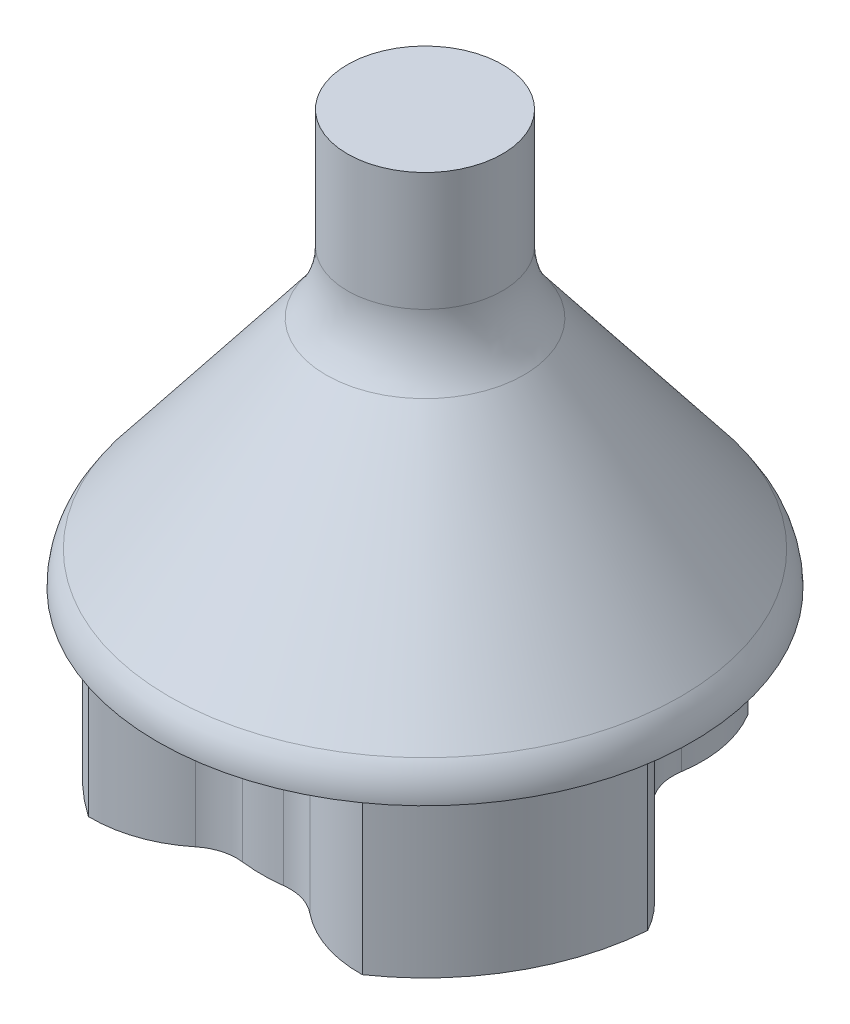
ISO-10303-21;
HEADER;
FILE_DESCRIPTION(('STEP AP214'),'2;1');
FILE_NAME('part.step','',(''),(''),'','','');
FILE_SCHEMA(('AUTOMOTIVE_DESIGN { 1 0 10303 214 1 1 1 1 }'));
ENDSEC;
DATA;
#1=APPLICATION_CONTEXT('core data for automotive mechanical design processes');
#2=APPLICATION_PROTOCOL_DEFINITION('international standard','automotive_design',2000,#1);
#3=PRODUCT_CONTEXT('',#1,'mechanical');
#4=PRODUCT('Part','Part','',(#3));
#5=PRODUCT_RELATED_PRODUCT_CATEGORY('part','',(#4));
#6=PRODUCT_DEFINITION_FORMATION('','',#4);
#7=PRODUCT_DEFINITION_CONTEXT('part definition',#1,'design');
#8=PRODUCT_DEFINITION('design','',#6,#7);
#9=PRODUCT_DEFINITION_SHAPE('','',#8);
#10=(LENGTH_UNIT() NAMED_UNIT(*) SI_UNIT(.MILLI.,.METRE.));
#11=(NAMED_UNIT(*) PLANE_ANGLE_UNIT() SI_UNIT($,.RADIAN.));
#12=(NAMED_UNIT(*) SI_UNIT($,.STERADIAN.) SOLID_ANGLE_UNIT());
#13=UNCERTAINTY_MEASURE_WITH_UNIT(LENGTH_MEASURE(1.E-05),#10,'distance_accuracy_value','');
#14=(GEOMETRIC_REPRESENTATION_CONTEXT(3) GLOBAL_UNCERTAINTY_ASSIGNED_CONTEXT((#13)) GLOBAL_UNIT_ASSIGNED_CONTEXT((#10,
#11,#12)) REPRESENTATION_CONTEXT('',''));
#15=CARTESIAN_POINT('',(0.,0.,0.));
#16=DIRECTION('',(0.,0.,1.));
#17=DIRECTION('',(1.,0.,0.));
#18=AXIS2_PLACEMENT_3D('',#15,#16,#17);
#19=CARTESIAN_POINT('',(0.,76.2,0.));
#20=DIRECTION('',(0.,1.,0.));
#21=DIRECTION('',(0.,0.,1.));
#22=AXIS2_PLACEMENT_3D('',#19,#20,#21);
#23=PLANE('',#22);
#24=CARTESIAN_POINT('',(0.,76.2,0.));
#25=DIRECTION('',(0.,1.,0.));
#26=DIRECTION('',(0.,0.,1.));
#27=AXIS2_PLACEMENT_3D('',#24,#25,#26);
#28=CIRCLE('',#27,10.16);
#29=CARTESIAN_POINT('',(0.,76.2,10.16));
#30=VERTEX_POINT('',#29);
#31=EDGE_CURVE('E43',#30,#30,#28,.T.);
#32=ORIENTED_EDGE('',*,*,#31,.T.);
#33=EDGE_LOOP('',(#32));
#34=FACE_BOUND('',#33,.T.);
#35=ADVANCED_FACE('F39',(#34),#23,.T.);
#36=CARTESIAN_POINT('',(22.0966045355212,25.4,-16.7861495957476));
#37=DIRECTION('',(0.,-1.,0.));
#38=DIRECTION('',(0.,0.,-1.));
#39=AXIS2_PLACEMENT_3D('',#36,#37,#38);
#40=CYLINDRICAL_SURFACE('',#39,6.34999999999998);
#41=DIRECTION('',(0.,-1.,0.));
#42=VECTOR('',#41,1.);
#43=CARTESIAN_POINT('',(15.8262854273046,25.4,-17.7889448296479));
#44=LINE('',#43,#42);
#45=CARTESIAN_POINT('',(15.8262854273046,21.8920636616788,-17.7889448296479));
#46=VERTEX_POINT('',#45);
#47=CARTESIAN_POINT('',(15.8262854273046,0.,-17.7889448296479));
#48=VERTEX_POINT('',#47);
#49=EDGE_CURVE('E234',#46,#48,#44,.T.);
#50=ORIENTED_EDGE('',*,*,#49,.F.);
#51=CARTESIAN_POINT('',(22.0966045355212,21.8920636616788,-16.7861495957476));
#52=DIRECTION('',(0.,-1.,0.));
#53=DIRECTION('',(0.,0.,-1.));
#54=AXIS2_PLACEMENT_3D('',#51,#52,#53);
#55=CIRCLE('',#54,6.34999999999998);
#56=CARTESIAN_POINT('',(17.0401732916945,21.8920636616788,-12.9449254319617));
#57=VERTEX_POINT('',#56);
#58=EDGE_CURVE('E313',#46,#57,#55,.F.);
#59=ORIENTED_EDGE('',*,*,#58,.T.);
#60=DIRECTION('',(0.,-1.,0.));
#61=VECTOR('',#60,1.);
#62=CARTESIAN_POINT('',(17.0401732916945,25.4,-12.9449254319617));
#63=LINE('',#62,#61);
#64=CARTESIAN_POINT('',(17.0401732916945,0.,-12.9449254319617));
#65=VERTEX_POINT('',#64);
#66=EDGE_CURVE('E231',#57,#65,#63,.T.);
#67=ORIENTED_EDGE('',*,*,#66,.T.);
#68=CARTESIAN_POINT('',(22.0966045355212,0.,-16.7861495957476));
#69=DIRECTION('',(0.,1.,0.));
#70=DIRECTION('',(0.,0.,-1.));
#71=AXIS2_PLACEMENT_3D('',#68,#69,#70);
#72=CIRCLE('',#71,6.34999999999998);
#73=EDGE_CURVE('E224',#48,#65,#72,.T.);
#74=ORIENTED_EDGE('',*,*,#73,.F.);
#75=EDGE_LOOP('',(#50,#59,#67,#74));
#76=FACE_BOUND('',#75,.T.);
#77=ADVANCED_FACE('F343',(#76),#40,.F.);
#78=CARTESIAN_POINT('',(0.,0.,0.));
#79=DIRECTION('',(0.,-1.,0.));
#80=DIRECTION('',(0.,0.,-1.));
#81=AXIS2_PLACEMENT_3D('',#78,#79,#80);
#82=PLANE('',#81);
#83=CARTESIAN_POINT('',(-1.70002900645727E-12,0.,-3.30291349825984E-12));
#84=DIRECTION('',(0.,-1.,0.));
#85=DIRECTION('',(0.,0.,-1.));
#86=AXIS2_PLACEMENT_3D('',#83,#84,#85);
#87=CIRCLE('',#86,21.3995);
#88=CARTESIAN_POINT('',(19.730720920134,0.,-8.28476023924504));
#89=VERTEX_POINT('',#88);
#90=EDGE_CURVE('E227',#65,#89,#87,.T.);
#91=ORIENTED_EDGE('',*,*,#90,.T.);
#92=CARTESIAN_POINT('',(25.5855342495534,0.,-10.7431460669077));
#93=DIRECTION('',(0.,1.,0.));
#94=DIRECTION('',(0.,0.,-1.));
#95=AXIS2_PLACEMENT_3D('',#92,#93,#94);
#96=CIRCLE('',#95,6.35);
#97=CARTESIAN_POINT('',(23.3188208427071,0.,-4.81149281244122));
#98=VERTEX_POINT('',#97);
#99=EDGE_CURVE('E11',#89,#98,#96,.T.);
#100=ORIENTED_EDGE('',*,*,#99,.T.);
#101=CARTESIAN_POINT('',(17.5976362038528,0.,10.1600000018194));
#102=DIRECTION('',(0.,-1.,0.));
#103=DIRECTION('',(0.,0.,-1.));
#104=AXIS2_PLACEMENT_3D('',#101,#102,#103);
#105=CIRCLE('',#104,16.0273999999788);
#106=CARTESIAN_POINT('',(31.6545140455146,0.,2.46053663714801));
#107=VERTEX_POINT('',#106);
#108=EDGE_CURVE('E48',#98,#107,#105,.T.);
#109=ORIENTED_EDGE('',*,*,#108,.T.);
#110=CARTESIAN_POINT('',(0.,0.,0.));
#111=DIRECTION('',(0.,-1.,0.));
#112=DIRECTION('',(0.,0.,-1.));
#113=AXIS2_PLACEMENT_3D('',#110,#111,#112);
#114=CIRCLE('',#113,31.7500000000067);
#115=CARTESIAN_POINT('',(17.9581442520505,0.,26.1833449930098));
#116=VERTEX_POINT('',#115);
#117=EDGE_CURVE('E165',#107,#116,#114,.T.);
#118=ORIENTED_EDGE('',*,*,#117,.T.);
#119=CARTESIAN_POINT('',(17.5976362038631,0.,10.1600000018254));
#120=DIRECTION('',(0.,-1.,0.));
#121=DIRECTION('',(0.,0.,-1.));
#122=AXIS2_PLACEMENT_3D('',#119,#120,#121);
#123=CIRCLE('',#122,16.0273999999789);
#124=CARTESIAN_POINT('',(7.49253541099745,0.,22.6004376438599));
#125=VERTEX_POINT('',#124);
#126=EDGE_CURVE('E173',#116,#125,#123,.T.);
#127=ORIENTED_EDGE('',*,*,#126,.T.);
#128=CARTESIAN_POINT('',(3.48892970858898,0.,27.5292956636899));
#129=DIRECTION('',(0.,1.,0.));
#130=DIRECTION('',(0.,0.,-1.));
#131=AXIS2_PLACEMENT_3D('',#128,#129,#130);
#132=CIRCLE('',#131,6.35000000000004);
#133=CARTESIAN_POINT('',(2.69054762424453,0.,21.2296856720001));
#134=VERTEX_POINT('',#133);
#135=EDGE_CURVE('E188',#125,#134,#132,.T.);
#136=ORIENTED_EDGE('',*,*,#135,.T.);
#137=CARTESIAN_POINT('',(3.73312492030209E-12,0.,5.52335954751015E-12));
#138=DIRECTION('',(0.,-1.,0.));
#139=DIRECTION('',(0.,0.,-1.));
#140=AXIS2_PLACEMENT_3D('',#137,#138,#139);
#141=CIRCLE('',#140,21.3995);
#142=CARTESIAN_POINT('',(-2.69054762763091,0.,21.22968567157));
#143=VERTEX_POINT('',#142);
#144=EDGE_CURVE('E191',#134,#143,#141,.T.);
#145=ORIENTED_EDGE('',*,*,#144,.T.);
#146=CARTESIAN_POINT('',(-3.48892971298245,0.,27.5292956631322));
#147=DIRECTION('',(0.,1.,0.));
#148=DIRECTION('',(0.,0.,-1.));
#149=AXIS2_PLACEMENT_3D('',#146,#147,#148);
#150=CIRCLE('',#149,6.35000000000002);
#151=CARTESIAN_POINT('',(-7.49253541461107,0.,22.6004376426687));
#152=VERTEX_POINT('',#151);
#153=EDGE_CURVE('E194',#143,#152,#150,.T.);
#154=ORIENTED_EDGE('',*,*,#153,.T.);
#155=CARTESIAN_POINT('',(-17.5976362053638,0.,10.1599999992132));
#156=DIRECTION('',(0.,-1.,0.));
#157=DIRECTION('',(0.,0.,-1.));
#158=AXIS2_PLACEMENT_3D('',#155,#156,#157);
#159=CIRCLE('',#158,16.0273999997497);
#160=CARTESIAN_POINT('',(-17.9581442562873,0.,26.1833449901068));
#161=VERTEX_POINT('',#160);
#162=EDGE_CURVE('E197',#152,#161,#159,.T.);
#163=ORIENTED_EDGE('',*,*,#162,.T.);
#164=CARTESIAN_POINT('',(1.76594849854439E-12,0.,8.46545056276682E-12));
#165=DIRECTION('',(0.,-1.,0.));
#166=DIRECTION('',(0.,0.,-1.));
#167=AXIS2_PLACEMENT_3D('',#164,#165,#166);
#168=CIRCLE('',#167,31.7500000000031);
#169=CARTESIAN_POINT('',(-31.6545140458436,0.,2.46053663285388));
#170=VERTEX_POINT('',#169);
#171=EDGE_CURVE('E200',#161,#170,#168,.T.);
#172=ORIENTED_EDGE('',*,*,#171,.T.);
#173=CARTESIAN_POINT('',(-17.5976362053693,0.,10.1599999992164));
#174=DIRECTION('',(0.,-1.,0.));
#175=DIRECTION('',(0.,0.,-1.));
#176=AXIS2_PLACEMENT_3D('',#173,#174,#175);
#177=CIRCLE('',#176,16.0273999997497);
#178=CARTESIAN_POINT('',(-23.3188208420658,0.,-4.81149281562363));
#179=VERTEX_POINT('',#178);
#180=EDGE_CURVE('E203',#170,#179,#177,.T.);
#181=ORIENTED_EDGE('',*,*,#180,.T.);
#182=CARTESIAN_POINT('',(-25.5855342480823,0.,-10.7431460704072));
#183=DIRECTION('',(0.,1.,0.));
#184=DIRECTION('',(0.,0.,-1.));
#185=AXIS2_PLACEMENT_3D('',#182,#183,#184);
#186=CIRCLE('',#185,6.34999999999997);
#187=CARTESIAN_POINT('',(-19.7307209190021,0.,-8.28476024193675));
#188=VERTEX_POINT('',#187);
#189=EDGE_CURVE('E206',#179,#188,#186,.T.);
#190=ORIENTED_EDGE('',*,*,#189,.T.);
#191=CARTESIAN_POINT('',(-1.70696790036118E-12,0.,8.71525074330748E-12));
#192=DIRECTION('',(0.,-1.,0.));
#193=DIRECTION('',(0.,0.,-1.));
#194=AXIS2_PLACEMENT_3D('',#191,#192,#193);
#195=CIRCLE('',#194,21.3995);
#196=CARTESIAN_POINT('',(-17.0401732940327,0.,-12.9449254288762));
#197=VERTEX_POINT('',#196);
#198=EDGE_CURVE('E209',#188,#197,#195,.T.);
#199=ORIENTED_EDGE('',*,*,#198,.T.);
#200=CARTESIAN_POINT('',(-22.0966045385524,0.,-16.7861495917501));
#201=DIRECTION('',(0.,1.,0.));
#202=DIRECTION('',(0.,0.,-1.));
#203=AXIS2_PLACEMENT_3D('',#200,#201,#202);
#204=CIRCLE('',#203,6.35000000000002);
#205=CARTESIAN_POINT('',(-15.8262854305166,0.,-17.7889448267813));
#206=VERTEX_POINT('',#205);
#207=EDGE_CURVE('E212',#197,#206,#204,.T.);
#208=ORIENTED_EDGE('',*,*,#207,.T.);
#209=CARTESIAN_POINT('',(-1.83426884792226E-09,0.,-20.3200000000002));
#210=DIRECTION('',(0.,-1.,0.));
#211=DIRECTION('',(0.,0.,-1.));
#212=AXIS2_PLACEMENT_3D('',#209,#210,#211);
#213=CIRCLE('',#212,16.0274);
#214=CARTESIAN_POINT('',(-13.6963697936226,0.,-28.6438816237733));
#215=VERTEX_POINT('',#214);
#216=EDGE_CURVE('E215',#206,#215,#213,.T.);
#217=ORIENTED_EDGE('',*,*,#216,.T.);
#218=CARTESIAN_POINT('',(-4.57966997657877E-12,0.,2.72004641033163E-12));
#219=DIRECTION('',(0.,-1.,0.));
#220=DIRECTION('',(0.,0.,-1.));
#221=AXIS2_PLACEMENT_3D('',#218,#219,#220);
#222=CIRCLE('',#221,31.7500000000067);
#223=CARTESIAN_POINT('',(13.6963697884654,0.,-28.6438816262349));
#224=VERTEX_POINT('',#223);
#225=EDGE_CURVE('E218',#215,#224,#222,.T.);
#226=ORIENTED_EDGE('',*,*,#225,.T.);
#227=CARTESIAN_POINT('',(-1.83426537847531E-09,0.,-20.3200000000122));
#228=DIRECTION('',(0.,-1.,0.));
#229=DIRECTION('',(0.,0.,-1.));
#230=AXIS2_PLACEMENT_3D('',#227,#228,#229);
#231=CIRCLE('',#230,16.0274);
#232=EDGE_CURVE('E221',#224,#48,#231,.T.);
#233=ORIENTED_EDGE('',*,*,#232,.T.);
#234=ORIENTED_EDGE('',*,*,#73,.T.);
#235=EDGE_LOOP('',(#91,#100,#109,#118,#127,#136,#145,#154,#163,#172,#181,#190,#199,#208,#217,
#226,#233,#234));
#236=FACE_BOUND('',#235,.T.);
#237=ADVANCED_FACE('F41',(#236),#82,.T.);
#238=CARTESIAN_POINT('',(-1.83426537847531E-09,25.4,-20.3200000000122));
#239=DIRECTION('',(0.,-1.,0.));
#240=DIRECTION('',(0.,0.,-1.));
#241=AXIS2_PLACEMENT_3D('',#238,#239,#240);
#242=CYLINDRICAL_SURFACE('',#241,16.0274);
#243=DIRECTION('',(0.,-1.,0.));
#244=VECTOR('',#243,1.);
#245=CARTESIAN_POINT('',(13.6963697884654,25.4,-28.6438816262349));
#246=LINE('',#245,#244);
#247=CARTESIAN_POINT('',(13.6963697884654,21.8920636616788,-28.6438816262349));
#248=VERTEX_POINT('',#247);
#249=EDGE_CURVE('E236',#248,#224,#246,.T.);
#250=ORIENTED_EDGE('',*,*,#249,.F.);
#251=CARTESIAN_POINT('',(-1.83426537847531E-09,21.8920636616788,-20.3200000000122));
#252=DIRECTION('',(0.,-1.,0.));
#253=DIRECTION('',(0.,0.,-1.));
#254=AXIS2_PLACEMENT_3D('',#251,#252,#253);
#255=CIRCLE('',#254,16.0274);
#256=EDGE_CURVE('E310',#248,#46,#255,.T.);
#257=ORIENTED_EDGE('',*,*,#256,.T.);
#258=ORIENTED_EDGE('',*,*,#49,.T.);
#259=ORIENTED_EDGE('',*,*,#232,.F.);
#260=EDGE_LOOP('',(#250,#257,#258,#259));
#261=FACE_BOUND('',#260,.T.);
#262=ADVANCED_FACE('F345',(#261),#242,.T.);
#263=CARTESIAN_POINT('',(-4.57966997657877E-12,25.4,2.72004641033163E-12));
#264=DIRECTION('',(0.,-1.,0.));
#265=DIRECTION('',(0.,0.,-1.));
#266=AXIS2_PLACEMENT_3D('',#263,#264,#265);
#267=CYLINDRICAL_SURFACE('',#266,31.7500000000067);
#268=DIRECTION('',(0.,-1.,0.));
#269=VECTOR('',#268,1.);
#270=CARTESIAN_POINT('',(-13.6963697936226,25.4,-28.6438816237733));
#271=LINE('',#270,#269);
#272=CARTESIAN_POINT('',(-13.6963697936226,21.8920636616788,-28.6438816237733));
#273=VERTEX_POINT('',#272);
#274=EDGE_CURVE('E238',#273,#215,#271,.T.);
#275=ORIENTED_EDGE('',*,*,#274,.F.);
#276=CARTESIAN_POINT('',(-4.57966997657877E-12,21.8920636616788,2.72004641033163E-12));
#277=DIRECTION('',(0.,-1.,0.));
#278=DIRECTION('',(0.,0.,-1.));
#279=AXIS2_PLACEMENT_3D('',#276,#277,#278);
#280=CIRCLE('',#279,31.7500000000067);
#281=EDGE_CURVE('E307',#273,#248,#280,.T.);
#282=ORIENTED_EDGE('',*,*,#281,.T.);
#283=ORIENTED_EDGE('',*,*,#249,.T.);
#284=ORIENTED_EDGE('',*,*,#225,.F.);
#285=EDGE_LOOP('',(#275,#282,#283,#284));
#286=FACE_BOUND('',#285,.T.);
#287=ADVANCED_FACE('F350',(#286),#267,.T.);
#288=CARTESIAN_POINT('',(-1.83426884792226E-09,25.4,-20.3200000000002));
#289=DIRECTION('',(0.,-1.,0.));
#290=DIRECTION('',(0.,0.,-1.));
#291=AXIS2_PLACEMENT_3D('',#288,#289,#290);
#292=CYLINDRICAL_SURFACE('',#291,16.0274);
#293=DIRECTION('',(0.,-1.,0.));
#294=VECTOR('',#293,1.);
#295=CARTESIAN_POINT('',(-15.8262854305166,25.4,-17.7889448267813));
#296=LINE('',#295,#294);
#297=CARTESIAN_POINT('',(-15.8262854305166,21.8920636616788,-17.7889448267813));
#298=VERTEX_POINT('',#297);
#299=EDGE_CURVE('E240',#298,#206,#296,.T.);
#300=ORIENTED_EDGE('',*,*,#299,.F.);
#301=CARTESIAN_POINT('',(-1.83426884792226E-09,21.8920636616788,-20.3200000000002));
#302=DIRECTION('',(0.,-1.,0.));
#303=DIRECTION('',(0.,0.,-1.));
#304=AXIS2_PLACEMENT_3D('',#301,#302,#303);
#305=CIRCLE('',#304,16.0274);
#306=EDGE_CURVE('E304',#298,#273,#305,.T.);
#307=ORIENTED_EDGE('',*,*,#306,.T.);
#308=ORIENTED_EDGE('',*,*,#274,.T.);
#309=ORIENTED_EDGE('',*,*,#216,.F.);
#310=EDGE_LOOP('',(#300,#307,#308,#309));
#311=FACE_BOUND('',#310,.T.);
#312=ADVANCED_FACE('F386',(#311),#292,.T.);
#313=CARTESIAN_POINT('',(-22.0966045385524,25.4,-16.7861495917501));
#314=DIRECTION('',(0.,-1.,0.));
#315=DIRECTION('',(0.,0.,-1.));
#316=AXIS2_PLACEMENT_3D('',#313,#314,#315);
#317=CYLINDRICAL_SURFACE('',#316,6.35000000000002);
#318=DIRECTION('',(0.,-1.,0.));
#319=VECTOR('',#318,1.);
#320=CARTESIAN_POINT('',(-17.0401732940327,25.4,-12.9449254288762));
#321=LINE('',#320,#319);
#322=CARTESIAN_POINT('',(-17.0401732940327,21.8920636616788,-12.9449254288762));
#323=VERTEX_POINT('',#322);
#324=EDGE_CURVE('E242',#323,#197,#321,.T.);
#325=ORIENTED_EDGE('',*,*,#324,.F.);
#326=CARTESIAN_POINT('',(-22.0966045385524,21.8920636616788,-16.7861495917501));
#327=DIRECTION('',(0.,-1.,0.));
#328=DIRECTION('',(0.,0.,-1.));
#329=AXIS2_PLACEMENT_3D('',#326,#327,#328);
#330=CIRCLE('',#329,6.35000000000002);
#331=EDGE_CURVE('E301',#323,#298,#330,.F.);
#332=ORIENTED_EDGE('',*,*,#331,.T.);
#333=ORIENTED_EDGE('',*,*,#299,.T.);
#334=ORIENTED_EDGE('',*,*,#207,.F.);
#335=EDGE_LOOP('',(#325,#332,#333,#334));
#336=FACE_BOUND('',#335,.T.);
#337=ADVANCED_FACE('F389',(#336),#317,.F.);
#338=CARTESIAN_POINT('',(-1.70696790036118E-12,25.4,8.71525074330748E-12));
#339=DIRECTION('',(0.,-1.,0.));
#340=DIRECTION('',(0.,0.,-1.));
#341=AXIS2_PLACEMENT_3D('',#338,#339,#340);
#342=CYLINDRICAL_SURFACE('',#341,21.3995);
#343=DIRECTION('',(0.,-1.,0.));
#344=VECTOR('',#343,1.);
#345=CARTESIAN_POINT('',(-19.7307209190021,25.4,-8.28476024193675));
#346=LINE('',#345,#344);
#347=CARTESIAN_POINT('',(-19.7307209190021,21.8920636616788,-8.28476024193675));
#348=VERTEX_POINT('',#347);
#349=EDGE_CURVE('E244',#348,#188,#346,.T.);
#350=ORIENTED_EDGE('',*,*,#349,.F.);
#351=CARTESIAN_POINT('',(-1.70696790036118E-12,21.8920636616788,8.71525074330748E-12));
#352=DIRECTION('',(0.,-1.,0.));
#353=DIRECTION('',(0.,0.,-1.));
#354=AXIS2_PLACEMENT_3D('',#351,#352,#353);
#355=CIRCLE('',#354,21.3995);
#356=EDGE_CURVE('E298',#348,#323,#355,.T.);
#357=ORIENTED_EDGE('',*,*,#356,.T.);
#358=ORIENTED_EDGE('',*,*,#324,.T.);
#359=ORIENTED_EDGE('',*,*,#198,.F.);
#360=EDGE_LOOP('',(#350,#357,#358,#359));
#361=FACE_BOUND('',#360,.T.);
#362=ADVANCED_FACE('F393',(#361),#342,.T.);
#363=CARTESIAN_POINT('',(-25.5855342480823,25.4,-10.7431460704072));
#364=DIRECTION('',(0.,-1.,0.));
#365=DIRECTION('',(0.,0.,-1.));
#366=AXIS2_PLACEMENT_3D('',#363,#364,#365);
#367=CYLINDRICAL_SURFACE('',#366,6.34999999999997);
#368=DIRECTION('',(0.,-1.,0.));
#369=VECTOR('',#368,1.);
#370=CARTESIAN_POINT('',(-23.3188208420658,25.4,-4.81149281562363));
#371=LINE('',#370,#369);
#372=CARTESIAN_POINT('',(-23.3188208420658,21.8920636616788,-4.81149281562363));
#373=VERTEX_POINT('',#372);
#374=EDGE_CURVE('E246',#373,#179,#371,.T.);
#375=ORIENTED_EDGE('',*,*,#374,.F.);
#376=CARTESIAN_POINT('',(-25.5855342480823,21.8920636616788,-10.7431460704072));
#377=DIRECTION('',(0.,-1.,0.));
#378=DIRECTION('',(0.,0.,-1.));
#379=AXIS2_PLACEMENT_3D('',#376,#377,#378);
#380=CIRCLE('',#379,6.34999999999997);
#381=EDGE_CURVE('E295',#373,#348,#380,.F.);
#382=ORIENTED_EDGE('',*,*,#381,.T.);
#383=ORIENTED_EDGE('',*,*,#349,.T.);
#384=ORIENTED_EDGE('',*,*,#189,.F.);
#385=EDGE_LOOP('',(#375,#382,#383,#384));
#386=FACE_BOUND('',#385,.T.);
#387=ADVANCED_FACE('F398',(#386),#367,.F.);
#388=CARTESIAN_POINT('',(-17.5976362053693,25.4,10.1599999992164));
#389=DIRECTION('',(0.,-1.,0.));
#390=DIRECTION('',(0.,0.,-1.));
#391=AXIS2_PLACEMENT_3D('',#388,#389,#390);
#392=CYLINDRICAL_SURFACE('',#391,16.0273999997497);
#393=DIRECTION('',(0.,-1.,0.));
#394=VECTOR('',#393,1.);
#395=CARTESIAN_POINT('',(-31.6545140458436,25.4,2.46053663285388));
#396=LINE('',#395,#394);
#397=CARTESIAN_POINT('',(-31.6545140458436,21.8920636616788,2.46053663285388));
#398=VERTEX_POINT('',#397);
#399=EDGE_CURVE('E248',#398,#170,#396,.T.);
#400=ORIENTED_EDGE('',*,*,#399,.F.);
#401=CARTESIAN_POINT('',(-17.5976362053693,21.8920636616788,10.1599999992164));
#402=DIRECTION('',(0.,-1.,0.));
#403=DIRECTION('',(0.,0.,-1.));
#404=AXIS2_PLACEMENT_3D('',#401,#402,#403);
#405=CIRCLE('',#404,16.0273999997497);
#406=EDGE_CURVE('E292',#398,#373,#405,.T.);
#407=ORIENTED_EDGE('',*,*,#406,.T.);
#408=ORIENTED_EDGE('',*,*,#374,.T.);
#409=ORIENTED_EDGE('',*,*,#180,.F.);
#410=EDGE_LOOP('',(#400,#407,#408,#409));
#411=FACE_BOUND('',#410,.T.);
#412=ADVANCED_FACE('F401',(#411),#392,.T.);
#413=CARTESIAN_POINT('',(1.76594849854439E-12,25.4,8.46545056276682E-12));
#414=DIRECTION('',(0.,-1.,0.));
#415=DIRECTION('',(0.,0.,-1.));
#416=AXIS2_PLACEMENT_3D('',#413,#414,#415);
#417=CYLINDRICAL_SURFACE('',#416,31.7500000000031);
#418=DIRECTION('',(0.,-1.,0.));
#419=VECTOR('',#418,1.);
#420=CARTESIAN_POINT('',(-17.9581442562873,25.4,26.1833449901068));
#421=LINE('',#420,#419);
#422=CARTESIAN_POINT('',(-17.9581442562873,21.8920636616788,26.1833449901068));
#423=VERTEX_POINT('',#422);
#424=EDGE_CURVE('E250',#423,#161,#421,.T.);
#425=ORIENTED_EDGE('',*,*,#424,.F.);
#426=CARTESIAN_POINT('',(1.76594849854439E-12,21.8920636616788,8.46545056276682E-12));
#427=DIRECTION('',(0.,-1.,0.));
#428=DIRECTION('',(0.,0.,-1.));
#429=AXIS2_PLACEMENT_3D('',#426,#427,#428);
#430=CIRCLE('',#429,31.7500000000031);
#431=EDGE_CURVE('E289',#423,#398,#430,.T.);
#432=ORIENTED_EDGE('',*,*,#431,.T.);
#433=ORIENTED_EDGE('',*,*,#399,.T.);
#434=ORIENTED_EDGE('',*,*,#171,.F.);
#435=EDGE_LOOP('',(#425,#432,#433,#434));
#436=FACE_BOUND('',#435,.T.);
#437=ADVANCED_FACE('F405',(#436),#417,.T.);
#438=CARTESIAN_POINT('',(-17.5976362053638,25.4,10.1599999992132));
#439=DIRECTION('',(0.,-1.,0.));
#440=DIRECTION('',(0.,0.,-1.));
#441=AXIS2_PLACEMENT_3D('',#438,#439,#440);
#442=CYLINDRICAL_SURFACE('',#441,16.0273999997497);
#443=DIRECTION('',(0.,-1.,0.));
#444=VECTOR('',#443,1.);
#445=CARTESIAN_POINT('',(-7.49253541461107,25.4,22.6004376426687));
#446=LINE('',#445,#444);
#447=CARTESIAN_POINT('',(-7.49253541461107,21.8920636616788,22.6004376426687));
#448=VERTEX_POINT('',#447);
#449=EDGE_CURVE('E252',#448,#152,#446,.T.);
#450=ORIENTED_EDGE('',*,*,#449,.F.);
#451=CARTESIAN_POINT('',(-17.5976362053638,21.8920636616788,10.1599999992132));
#452=DIRECTION('',(0.,-1.,0.));
#453=DIRECTION('',(0.,0.,-1.));
#454=AXIS2_PLACEMENT_3D('',#451,#452,#453);
#455=CIRCLE('',#454,16.0273999997497);
#456=EDGE_CURVE('E286',#448,#423,#455,.T.);
#457=ORIENTED_EDGE('',*,*,#456,.T.);
#458=ORIENTED_EDGE('',*,*,#424,.T.);
#459=ORIENTED_EDGE('',*,*,#162,.F.);
#460=EDGE_LOOP('',(#450,#457,#458,#459));
#461=FACE_BOUND('',#460,.T.);
#462=ADVANCED_FACE('F410',(#461),#442,.T.);
#463=CARTESIAN_POINT('',(-3.48892971298245,25.4,27.5292956631322));
#464=DIRECTION('',(0.,-1.,0.));
#465=DIRECTION('',(0.,0.,-1.));
#466=AXIS2_PLACEMENT_3D('',#463,#464,#465);
#467=CYLINDRICAL_SURFACE('',#466,6.35000000000002);
#468=DIRECTION('',(0.,-1.,0.));
#469=VECTOR('',#468,1.);
#470=CARTESIAN_POINT('',(-2.69054762763091,25.4,21.22968567157));
#471=LINE('',#470,#469);
#472=CARTESIAN_POINT('',(-2.69054762763091,21.8920636616788,21.22968567157));
#473=VERTEX_POINT('',#472);
#474=EDGE_CURVE('E254',#473,#143,#471,.T.);
#475=ORIENTED_EDGE('',*,*,#474,.F.);
#476=CARTESIAN_POINT('',(-3.48892971298245,21.8920636616788,27.5292956631322));
#477=DIRECTION('',(0.,-1.,0.));
#478=DIRECTION('',(0.,0.,-1.));
#479=AXIS2_PLACEMENT_3D('',#476,#477,#478);
#480=CIRCLE('',#479,6.35000000000002);
#481=EDGE_CURVE('E283',#473,#448,#480,.F.);
#482=ORIENTED_EDGE('',*,*,#481,.T.);
#483=ORIENTED_EDGE('',*,*,#449,.T.);
#484=ORIENTED_EDGE('',*,*,#153,.F.);
#485=EDGE_LOOP('',(#475,#482,#483,#484));
#486=FACE_BOUND('',#485,.T.);
#487=ADVANCED_FACE('F413',(#486),#467,.F.);
#488=CARTESIAN_POINT('',(3.73312492030209E-12,25.4,5.52335954751015E-12));
#489=DIRECTION('',(0.,-1.,0.));
#490=DIRECTION('',(0.,0.,-1.));
#491=AXIS2_PLACEMENT_3D('',#488,#489,#490);
#492=CYLINDRICAL_SURFACE('',#491,21.3995);
#493=DIRECTION('',(0.,-1.,0.));
#494=VECTOR('',#493,1.);
#495=CARTESIAN_POINT('',(2.69054762424453,25.4,21.2296856720001));
#496=LINE('',#495,#494);
#497=CARTESIAN_POINT('',(2.69054762424453,21.8920636616788,21.2296856720001));
#498=VERTEX_POINT('',#497);
#499=EDGE_CURVE('E256',#498,#134,#496,.T.);
#500=ORIENTED_EDGE('',*,*,#499,.F.);
#501=CARTESIAN_POINT('',(3.73312492030209E-12,21.8920636616788,5.52335954751015E-12));
#502=DIRECTION('',(0.,-1.,0.));
#503=DIRECTION('',(0.,0.,-1.));
#504=AXIS2_PLACEMENT_3D('',#501,#502,#503);
#505=CIRCLE('',#504,21.3995);
#506=EDGE_CURVE('E280',#498,#473,#505,.T.);
#507=ORIENTED_EDGE('',*,*,#506,.T.);
#508=ORIENTED_EDGE('',*,*,#474,.T.);
#509=ORIENTED_EDGE('',*,*,#144,.F.);
#510=EDGE_LOOP('',(#500,#507,#508,#509));
#511=FACE_BOUND('',#510,.T.);
#512=ADVANCED_FACE('F417',(#511),#492,.T.);
#513=CARTESIAN_POINT('',(3.48892970858898,25.4,27.5292956636899));
#514=DIRECTION('',(0.,-1.,0.));
#515=DIRECTION('',(0.,0.,-1.));
#516=AXIS2_PLACEMENT_3D('',#513,#514,#515);
#517=CYLINDRICAL_SURFACE('',#516,6.35000000000004);
#518=DIRECTION('',(0.,-1.,0.));
#519=VECTOR('',#518,1.);
#520=CARTESIAN_POINT('',(7.49253541099745,25.4,22.6004376438599));
#521=LINE('',#520,#519);
#522=CARTESIAN_POINT('',(7.49253541099745,21.8920636616788,22.6004376438599));
#523=VERTEX_POINT('',#522);
#524=EDGE_CURVE('E62',#523,#125,#521,.T.);
#525=ORIENTED_EDGE('',*,*,#524,.F.);
#526=CARTESIAN_POINT('',(3.48892970858898,21.8920636616788,27.5292956636899));
#527=DIRECTION('',(0.,-1.,0.));
#528=DIRECTION('',(0.,0.,-1.));
#529=AXIS2_PLACEMENT_3D('',#526,#527,#528);
#530=CIRCLE('',#529,6.35000000000004);
#531=EDGE_CURVE('E277',#523,#498,#530,.F.);
#532=ORIENTED_EDGE('',*,*,#531,.T.);
#533=ORIENTED_EDGE('',*,*,#499,.T.);
#534=ORIENTED_EDGE('',*,*,#135,.F.);
#535=EDGE_LOOP('',(#525,#532,#533,#534));
#536=FACE_BOUND('',#535,.T.);
#537=ADVANCED_FACE('F419',(#536),#517,.F.);
#538=CARTESIAN_POINT('',(17.5976362038631,25.4,10.1600000018254));
#539=DIRECTION('',(0.,-1.,0.));
#540=DIRECTION('',(0.,0.,-1.));
#541=AXIS2_PLACEMENT_3D('',#538,#539,#540);
#542=CYLINDRICAL_SURFACE('',#541,16.0273999999789);
#543=DIRECTION('',(0.,-1.,0.));
#544=VECTOR('',#543,1.);
#545=CARTESIAN_POINT('',(17.9581442520505,25.4,26.1833449930098));
#546=LINE('',#545,#544);
#547=CARTESIAN_POINT('',(17.9581442520505,21.8920636616788,26.1833449930098));
#548=VERTEX_POINT('',#547);
#549=EDGE_CURVE('E55',#548,#116,#546,.T.);
#550=ORIENTED_EDGE('',*,*,#549,.F.);
#551=CARTESIAN_POINT('',(17.5976362038631,21.8920636616788,10.1600000018254));
#552=DIRECTION('',(0.,-1.,0.));
#553=DIRECTION('',(0.,0.,-1.));
#554=AXIS2_PLACEMENT_3D('',#551,#552,#553);
#555=CIRCLE('',#554,16.0273999999789);
#556=EDGE_CURVE('E275',#548,#523,#555,.T.);
#557=ORIENTED_EDGE('',*,*,#556,.T.);
#558=ORIENTED_EDGE('',*,*,#524,.T.);
#559=ORIENTED_EDGE('',*,*,#126,.F.);
#560=EDGE_LOOP('',(#550,#557,#558,#559));
#561=FACE_BOUND('',#560,.T.);
#562=ADVANCED_FACE('F420',(#561),#542,.T.);
#563=CARTESIAN_POINT('',(0.,25.4,0.));
#564=DIRECTION('',(0.,-1.,0.));
#565=DIRECTION('',(0.,0.,-1.));
#566=AXIS2_PLACEMENT_3D('',#563,#564,#565);
#567=CYLINDRICAL_SURFACE('',#566,31.7500000000067);
#568=DIRECTION('',(0.,-1.,0.));
#569=VECTOR('',#568,1.);
#570=CARTESIAN_POINT('',(31.6545140455146,25.4,2.46053663714801));
#571=LINE('',#570,#569);
#572=CARTESIAN_POINT('',(31.6545140455146,21.8920636616788,2.46053663714801));
#573=VERTEX_POINT('',#572);
#574=EDGE_CURVE('E168',#573,#107,#571,.T.);
#575=ORIENTED_EDGE('',*,*,#574,.F.);
#576=CARTESIAN_POINT('',(0.,21.8920636616788,0.));
#577=DIRECTION('',(0.,-1.,0.));
#578=DIRECTION('',(0.,0.,-1.));
#579=AXIS2_PLACEMENT_3D('',#576,#577,#578);
#580=CIRCLE('',#579,31.7500000000067);
#581=EDGE_CURVE('E273',#573,#548,#580,.T.);
#582=ORIENTED_EDGE('',*,*,#581,.T.);
#583=ORIENTED_EDGE('',*,*,#549,.T.);
#584=ORIENTED_EDGE('',*,*,#117,.F.);
#585=EDGE_LOOP('',(#575,#582,#583,#584));
#586=FACE_BOUND('',#585,.T.);
#587=ADVANCED_FACE('F167',(#586),#567,.T.);
#588=CARTESIAN_POINT('',(17.5976362038528,25.4,10.1600000018194));
#589=DIRECTION('',(0.,-1.,0.));
#590=DIRECTION('',(0.,0.,-1.));
#591=AXIS2_PLACEMENT_3D('',#588,#589,#590);
#592=CYLINDRICAL_SURFACE('',#591,16.0273999999788);
#593=DIRECTION('',(0.,-1.,0.));
#594=VECTOR('',#593,1.);
#595=CARTESIAN_POINT('',(23.3188208427071,25.4,-4.81149281244122));
#596=LINE('',#595,#594);
#597=CARTESIAN_POINT('',(23.3188208427071,21.8920636616788,-4.81149281244122));
#598=VERTEX_POINT('',#597);
#599=EDGE_CURVE('E181',#598,#98,#596,.T.);
#600=ORIENTED_EDGE('',*,*,#599,.F.);
#601=CARTESIAN_POINT('',(17.5976362038528,21.8920636616788,10.1600000018194));
#602=DIRECTION('',(0.,-1.,0.));
#603=DIRECTION('',(0.,0.,-1.));
#604=AXIS2_PLACEMENT_3D('',#601,#602,#603);
#605=CIRCLE('',#604,16.0273999999788);
#606=EDGE_CURVE('E180',#598,#573,#605,.T.);
#607=ORIENTED_EDGE('',*,*,#606,.T.);
#608=ORIENTED_EDGE('',*,*,#574,.T.);
#609=ORIENTED_EDGE('',*,*,#108,.F.);
#610=EDGE_LOOP('',(#600,#607,#608,#609));
#611=FACE_BOUND('',#610,.T.);
#612=ADVANCED_FACE('F179',(#611),#592,.T.);
#613=CARTESIAN_POINT('',(25.5855342495534,25.4,-10.7431460669077));
#614=DIRECTION('',(0.,-1.,0.));
#615=DIRECTION('',(0.,0.,-1.));
#616=AXIS2_PLACEMENT_3D('',#613,#614,#615);
#617=CYLINDRICAL_SURFACE('',#616,6.35);
#618=DIRECTION('',(0.,-1.,0.));
#619=VECTOR('',#618,1.);
#620=CARTESIAN_POINT('',(19.730720920134,25.4,-8.28476023924504));
#621=LINE('',#620,#619);
#622=CARTESIAN_POINT('',(19.730720920134,21.8920636616788,-8.28476023924504));
#623=VERTEX_POINT('',#622);
#624=EDGE_CURVE('E229',#623,#89,#621,.T.);
#625=ORIENTED_EDGE('',*,*,#624,.F.);
#626=CARTESIAN_POINT('',(25.5855342495534,21.8920636616788,-10.7431460669077));
#627=DIRECTION('',(0.,-1.,0.));
#628=DIRECTION('',(0.,0.,-1.));
#629=AXIS2_PLACEMENT_3D('',#626,#627,#628);
#630=CIRCLE('',#629,6.35);
#631=EDGE_CURVE('E319',#623,#598,#630,.F.);
#632=ORIENTED_EDGE('',*,*,#631,.T.);
#633=ORIENTED_EDGE('',*,*,#599,.T.);
#634=ORIENTED_EDGE('',*,*,#99,.F.);
#635=EDGE_LOOP('',(#625,#632,#633,#634));
#636=FACE_BOUND('',#635,.T.);
#637=ADVANCED_FACE('F363',(#636),#617,.F.);
#638=CARTESIAN_POINT('',(-1.70002900645727E-12,25.4,-3.30291349825984E-12));
#639=DIRECTION('',(0.,-1.,0.));
#640=DIRECTION('',(0.,0.,-1.));
#641=AXIS2_PLACEMENT_3D('',#638,#639,#640);
#642=CYLINDRICAL_SURFACE('',#641,21.3995);
#643=ORIENTED_EDGE('',*,*,#66,.F.);
#644=CARTESIAN_POINT('',(-1.70002900645727E-12,21.8920636616788,-3.30291349825984E-12));
#645=DIRECTION('',(0.,-1.,0.));
#646=DIRECTION('',(0.,0.,-1.));
#647=AXIS2_PLACEMENT_3D('',#644,#645,#646);
#648=CIRCLE('',#647,21.3995);
#649=EDGE_CURVE('E316',#57,#623,#648,.T.);
#650=ORIENTED_EDGE('',*,*,#649,.T.);
#651=ORIENTED_EDGE('',*,*,#624,.T.);
#652=ORIENTED_EDGE('',*,*,#90,.F.);
#653=EDGE_LOOP('',(#643,#650,#651,#652));
#654=FACE_BOUND('',#653,.T.);
#655=ADVANCED_FACE('F360',(#654),#642,.T.);
#656=CARTESIAN_POINT('',(0.,21.8920636616788,0.));
#657=DIRECTION('',(0.,-1.,0.));
#658=DIRECTION('',(0.,0.,-1.));
#659=AXIS2_PLACEMENT_3D('',#656,#657,#658);
#660=PLANE('',#659);
#661=ORIENTED_EDGE('',*,*,#649,.F.);
#662=ORIENTED_EDGE('',*,*,#58,.F.);
#663=ORIENTED_EDGE('',*,*,#256,.F.);
#664=ORIENTED_EDGE('',*,*,#281,.F.);
#665=ORIENTED_EDGE('',*,*,#306,.F.);
#666=ORIENTED_EDGE('',*,*,#331,.F.);
#667=ORIENTED_EDGE('',*,*,#356,.F.);
#668=ORIENTED_EDGE('',*,*,#381,.F.);
#669=ORIENTED_EDGE('',*,*,#406,.F.);
#670=ORIENTED_EDGE('',*,*,#431,.F.);
#671=ORIENTED_EDGE('',*,*,#456,.F.);
#672=ORIENTED_EDGE('',*,*,#481,.F.);
#673=ORIENTED_EDGE('',*,*,#506,.F.);
#674=ORIENTED_EDGE('',*,*,#531,.F.);
#675=ORIENTED_EDGE('',*,*,#556,.F.);
#676=ORIENTED_EDGE('',*,*,#581,.F.);
#677=ORIENTED_EDGE('',*,*,#606,.F.);
#678=ORIENTED_EDGE('',*,*,#631,.F.);
#679=EDGE_LOOP('',(#661,#662,#663,#664,#665,#666,#667,#668,#669,#670,#671,#672,#673,#674,#675,
#676,#677,#678));
#680=FACE_BOUND('',#679,.T.);
#681=CARTESIAN_POINT('',(0.,21.8920636616788,0.));
#682=DIRECTION('',(0.,1.,0.));
#683=DIRECTION('',(0.,0.,1.));
#684=AXIS2_PLACEMENT_3D('',#681,#682,#683);
#685=CIRCLE('',#684,35.052);
#686=CARTESIAN_POINT('',(0.,21.8920636616788,35.052));
#687=VERTEX_POINT('',#686);
#688=EDGE_CURVE('E232',#687,#687,#685,.T.);
#689=ORIENTED_EDGE('',*,*,#688,.F.);
#690=EDGE_LOOP('',(#689));
#691=FACE_BOUND('',#690,.T.);
#692=ADVANCED_FACE('F362',(#680,#691),#660,.T.);
#693=CARTESIAN_POINT('',(0.,21.8920636616788,0.));
#694=DIRECTION('',(0.,1.,0.));
#695=DIRECTION('',(0.,0.,1.));
#696=AXIS2_PLACEMENT_3D('',#693,#694,#695);
#697=TOROIDAL_SURFACE('',#696,27.94,7.112);
#698=ORIENTED_EDGE('',*,*,#688,.T.);
#699=EDGE_LOOP('',(#698));
#700=FACE_BOUND('',#699,.T.);
#701=CARTESIAN_POINT('',(0.,26.2800756484902,0.));
#702=DIRECTION('',(0.,1.,0.));
#703=DIRECTION('',(0.,0.,1.));
#704=AXIS2_PLACEMENT_3D('',#701,#702,#703);
#705=CIRCLE('',#704,33.5369540648105);
#706=CARTESIAN_POINT('',(0.,26.2800756484902,33.5369540648105));
#707=VERTEX_POINT('',#706);
#708=EDGE_CURVE('E263',#707,#707,#705,.T.);
#709=ORIENTED_EDGE('',*,*,#708,.F.);
#710=EDGE_LOOP('',(#709));
#711=FACE_BOUND('',#710,.T.);
#712=ADVANCED_FACE('F369',(#700,#711),#697,.T.);
#713=CARTESIAN_POINT('',(0.,52.5087712199571,0.));
#714=DIRECTION('',(0.,-1.,0.));
#715=DIRECTION('',(0.,0.,-1.));
#716=AXIS2_PLACEMENT_3D('',#713,#714,#715);
#717=CONICAL_SURFACE('',#716,12.9736567367805,0.664908417409286);
#718=ORIENTED_EDGE('',*,*,#708,.T.);
#719=EDGE_LOOP('',(#718));
#720=FACE_BOUND('',#719,.T.);
#721=CARTESIAN_POINT('',(0.,52.5087712199571,0.));
#722=DIRECTION('',(0.,1.,0.));
#723=DIRECTION('',(0.,0.,1.));
#724=AXIS2_PLACEMENT_3D('',#721,#722,#723);
#725=CIRCLE('',#724,12.9736567367805);
#726=CARTESIAN_POINT('',(0.,52.5087712199571,12.9736567367805));
#727=VERTEX_POINT('',#726);
#728=EDGE_CURVE('E266',#727,#727,#725,.T.);
#729=ORIENTED_EDGE('',*,*,#728,.F.);
#730=EDGE_LOOP('',(#729));
#731=FACE_BOUND('',#730,.T.);
#732=ADVANCED_FACE('F339',(#720,#731),#717,.T.);
#733=CARTESIAN_POINT('',(0.,60.6579363383213,0.));
#734=DIRECTION('',(0.,1.,0.));
#735=DIRECTION('',(0.,0.,1.));
#736=AXIS2_PLACEMENT_3D('',#733,#734,#735);
#737=TOROIDAL_SURFACE('',#736,23.368,13.208);
#738=ORIENTED_EDGE('',*,*,#728,.T.);
#739=EDGE_LOOP('',(#738));
#740=FACE_BOUND('',#739,.T.);
#741=CARTESIAN_POINT('',(0.,60.6579363383213,0.));
#742=DIRECTION('',(0.,1.,0.));
#743=DIRECTION('',(0.,0.,1.));
#744=AXIS2_PLACEMENT_3D('',#741,#742,#743);
#745=CIRCLE('',#744,10.16);
#746=CARTESIAN_POINT('',(0.,60.6579363383213,10.16));
#747=VERTEX_POINT('',#746);
#748=EDGE_CURVE('E269',#747,#747,#745,.T.);
#749=ORIENTED_EDGE('',*,*,#748,.F.);
#750=EDGE_LOOP('',(#749));
#751=FACE_BOUND('',#750,.T.);
#752=ADVANCED_FACE('F333',(#740,#751),#737,.F.);
#753=CARTESIAN_POINT('',(0.,76.2,0.));
#754=DIRECTION('',(0.,1.,0.));
#755=DIRECTION('',(0.,0.,1.));
#756=AXIS2_PLACEMENT_3D('',#753,#754,#755);
#757=CYLINDRICAL_SURFACE('',#756,10.16);
#758=ORIENTED_EDGE('',*,*,#748,.T.);
#759=EDGE_LOOP('',(#758));
#760=FACE_BOUND('',#759,.T.);
#761=ORIENTED_EDGE('',*,*,#31,.F.);
#762=EDGE_LOOP('',(#761));
#763=FACE_BOUND('',#762,.T.);
#764=ADVANCED_FACE('F331',(#760,#763),#757,.T.);
#765=CLOSED_SHELL('',(#35,#77,#237,#262,#287,#312,#337,#362,#387,#412,#437,#462,#487,#512,#537,
#562,#587,#612,#637,#655,#692,#712,#732,#752,#764));
#766=MANIFOLD_SOLID_BREP('B2',#765);
#767=ADVANCED_BREP_SHAPE_REPRESENTATION('',(#18,#766),#14);
#768=SHAPE_DEFINITION_REPRESENTATION(#9,#767);
ENDSEC;
END-ISO-10303-21;
